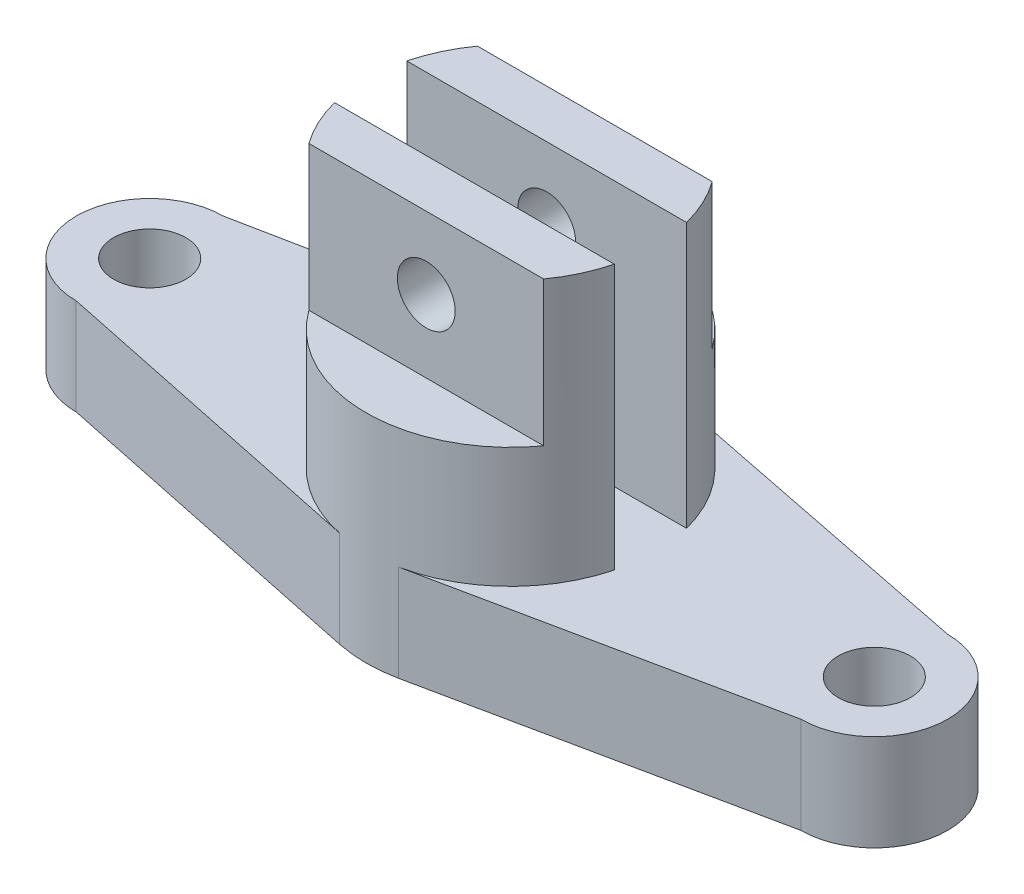
ISO-10303-21;
HEADER;
FILE_DESCRIPTION(('STEP AP214'),'2;1');
FILE_NAME('part.step','',(''),(''),'','','');
FILE_SCHEMA(('AUTOMOTIVE_DESIGN { 1 0 10303 214 1 1 1 1 }'));
ENDSEC;
DATA;
#1=APPLICATION_CONTEXT('core data for automotive mechanical design processes');
#2=APPLICATION_PROTOCOL_DEFINITION('international standard','automotive_design',2000,#1);
#3=PRODUCT_CONTEXT('',#1,'mechanical');
#4=PRODUCT('Part','Part','',(#3));
#5=PRODUCT_RELATED_PRODUCT_CATEGORY('part','',(#4));
#6=PRODUCT_DEFINITION_FORMATION('','',#4);
#7=PRODUCT_DEFINITION_CONTEXT('part definition',#1,'design');
#8=PRODUCT_DEFINITION('design','',#6,#7);
#9=PRODUCT_DEFINITION_SHAPE('','',#8);
#10=(LENGTH_UNIT() NAMED_UNIT(*) SI_UNIT(.MILLI.,.METRE.));
#11=(NAMED_UNIT(*) PLANE_ANGLE_UNIT() SI_UNIT($,.RADIAN.));
#12=(NAMED_UNIT(*) SI_UNIT($,.STERADIAN.) SOLID_ANGLE_UNIT());
#13=UNCERTAINTY_MEASURE_WITH_UNIT(LENGTH_MEASURE(1.E-05),#10,'distance_accuracy_value','');
#14=(GEOMETRIC_REPRESENTATION_CONTEXT(3) GLOBAL_UNCERTAINTY_ASSIGNED_CONTEXT((#13)) GLOBAL_UNIT_ASSIGNED_CONTEXT((#10,
#11,#12)) REPRESENTATION_CONTEXT('',''));
#15=CARTESIAN_POINT('',(0.,0.,0.));
#16=DIRECTION('',(0.,0.,1.));
#17=DIRECTION('',(1.,0.,0.));
#18=AXIS2_PLACEMENT_3D('',#15,#16,#17);
#19=CARTESIAN_POINT('',(0.,45.,0.));
#20=DIRECTION('',(0.,1.,0.));
#21=DIRECTION('',(0.,0.,1.));
#22=AXIS2_PLACEMENT_3D('',#19,#20,#21);
#23=PLANE('',#22);
#24=CARTESIAN_POINT('',(0.,45.,0.));
#25=DIRECTION('',(0.,1.,0.));
#26=DIRECTION('',(0.,0.,1.));
#27=AXIS2_PLACEMENT_3D('',#24,#25,#26);
#28=CIRCLE('',#27,30.);
#29=CARTESIAN_POINT('',(-24.3669858620224,45.,17.5));
#30=VERTEX_POINT('',#29);
#31=CARTESIAN_POINT('',(24.3669858620224,45.,17.5));
#32=VERTEX_POINT('',#31);
#33=EDGE_CURVE('E184',#30,#32,#28,.T.);
#34=ORIENTED_EDGE('',*,*,#33,.T.);
#35=DIRECTION('',(-1.,0.,0.));
#36=VECTOR('',#35,1.);
#37=CARTESIAN_POINT('',(0.,45.,17.5));
#38=LINE('',#37,#36);
#39=EDGE_CURVE('E190',#32,#30,#38,.T.);
#40=ORIENTED_EDGE('',*,*,#39,.T.);
#41=EDGE_LOOP('',(#34,#40));
#42=FACE_BOUND('',#41,.T.);
#43=ADVANCED_FACE('F53',(#42),#23,.T.);
#44=CARTESIAN_POINT('',(5.88348405414552,20.,-29.4174202707276));
#45=DIRECTION('',(-0.196116135138184,0.,0.98058067569092));
#46=DIRECTION('',(0.98058067569092,0.,0.196116135138184));
#47=AXIS2_PLACEMENT_3D('',#44,#45,#46);
#48=PLANE('',#47);
#49=DIRECTION('',(-0.98058067569092,0.,-0.196116135138184));
#50=VECTOR('',#49,1.);
#51=CARTESIAN_POINT('',(5.88348405414552,0.,-29.4174202707276));
#52=LINE('',#51,#50);
#53=CARTESIAN_POINT('',(75.2234894036946,0.,-15.5494192008178));
#54=VERTEX_POINT('',#53);
#55=CARTESIAN_POINT('',(5.88348405414552,0.,-29.4174202707276));
#56=VERTEX_POINT('',#55);
#57=EDGE_CURVE('E229',#54,#56,#52,.T.);
#58=ORIENTED_EDGE('',*,*,#57,.T.);
#59=DIRECTION('',(0.,-1.,0.));
#60=VECTOR('',#59,1.);
#61=CARTESIAN_POINT('',(5.88348405414552,20.,-29.4174202707276));
#62=LINE('',#61,#60);
#63=CARTESIAN_POINT('',(5.88348405414552,20.,-29.4174202707276));
#64=VERTEX_POINT('',#63);
#65=EDGE_CURVE('E301',#64,#56,#62,.T.);
#66=ORIENTED_EDGE('',*,*,#65,.F.);
#67=DIRECTION('',(-0.98058067569092,0.,-0.196116135138184));
#68=VECTOR('',#67,1.);
#69=CARTESIAN_POINT('',(5.88348405414552,20.,-29.4174202707276));
#70=LINE('',#69,#68);
#71=CARTESIAN_POINT('',(75.2234894036946,20.,-15.5494192008178));
#72=VERTEX_POINT('',#71);
#73=EDGE_CURVE('E239',#72,#64,#70,.T.);
#74=ORIENTED_EDGE('',*,*,#73,.F.);
#75=DIRECTION('',(0.,-1.,0.));
#76=VECTOR('',#75,1.);
#77=CARTESIAN_POINT('',(75.2234894036946,20.,-15.5494192008178));
#78=LINE('',#77,#76);
#79=EDGE_CURVE('E260',#72,#54,#78,.T.);
#80=ORIENTED_EDGE('',*,*,#79,.T.);
#81=EDGE_LOOP('',(#58,#66,#74,#80));
#82=FACE_BOUND('',#81,.T.);
#83=ADVANCED_FACE('F55',(#82),#48,.F.);
#84=CARTESIAN_POINT('',(0.,20.,0.));
#85=DIRECTION('',(0.,-1.,0.));
#86=DIRECTION('',(0.,0.,-1.));
#87=AXIS2_PLACEMENT_3D('',#84,#85,#86);
#88=CYLINDRICAL_SURFACE('',#87,30.);
#89=CARTESIAN_POINT('',(0.,0.,0.));
#90=DIRECTION('',(0.,1.,0.));
#91=DIRECTION('',(0.,0.,1.));
#92=AXIS2_PLACEMENT_3D('',#89,#90,#91);
#93=CIRCLE('',#92,30.);
#94=CARTESIAN_POINT('',(-5.88348405414552,0.,-29.4174202707276));
#95=VERTEX_POINT('',#94);
#96=EDGE_CURVE('E263',#56,#95,#93,.T.);
#97=ORIENTED_EDGE('',*,*,#96,.T.);
#98=DIRECTION('',(0.,-1.,0.));
#99=VECTOR('',#98,1.);
#100=CARTESIAN_POINT('',(-5.88348405414552,20.,-29.4174202707276));
#101=LINE('',#100,#99);
#102=CARTESIAN_POINT('',(-5.88348405414552,20.,-29.4174202707276));
#103=VERTEX_POINT('',#102);
#104=EDGE_CURVE('E300',#103,#95,#101,.T.);
#105=ORIENTED_EDGE('',*,*,#104,.F.);
#106=CARTESIAN_POINT('',(0.,20.,0.));
#107=DIRECTION('',(0.,1.,0.));
#108=DIRECTION('',(0.,0.,1.));
#109=AXIS2_PLACEMENT_3D('',#106,#107,#108);
#110=CIRCLE('',#109,30.);
#111=CARTESIAN_POINT('',(-29.0473750965556,20.,-7.5));
#112=VERTEX_POINT('',#111);
#113=EDGE_CURVE('E62',#103,#112,#110,.T.);
#114=ORIENTED_EDGE('',*,*,#113,.T.);
#115=DIRECTION('',(0.,-1.,0.));
#116=VECTOR('',#115,1.);
#117=CARTESIAN_POINT('',(-29.0473750965556,45.,-7.5));
#118=LINE('',#117,#116);
#119=CARTESIAN_POINT('',(-29.0473750965556,75.,-7.5));
#120=VERTEX_POINT('',#119);
#121=EDGE_CURVE('E200',#120,#112,#118,.T.);
#122=ORIENTED_EDGE('',*,*,#121,.F.);
#123=CARTESIAN_POINT('',(0.,75.,0.));
#124=DIRECTION('',(0.,1.,0.));
#125=DIRECTION('',(0.,0.,1.));
#126=AXIS2_PLACEMENT_3D('',#123,#124,#125);
#127=CIRCLE('',#126,30.);
#128=CARTESIAN_POINT('',(-24.3669858620224,75.,-17.5));
#129=VERTEX_POINT('',#128);
#130=EDGE_CURVE('E202',#129,#120,#127,.T.);
#131=ORIENTED_EDGE('',*,*,#130,.F.);
#132=DIRECTION('',(0.,-1.,0.));
#133=VECTOR('',#132,1.);
#134=CARTESIAN_POINT('',(-24.3669858620224,75.,-17.5));
#135=LINE('',#134,#133);
#136=CARTESIAN_POINT('',(-24.3669858620224,45.,-17.5));
#137=VERTEX_POINT('',#136);
#138=EDGE_CURVE('E212',#129,#137,#135,.T.);
#139=ORIENTED_EDGE('',*,*,#138,.T.);
#140=CARTESIAN_POINT('',(0.,45.,0.));
#141=DIRECTION('',(0.,1.,0.));
#142=DIRECTION('',(0.,0.,1.));
#143=AXIS2_PLACEMENT_3D('',#140,#141,#142);
#144=CIRCLE('',#143,30.);
#145=CARTESIAN_POINT('',(24.3669858620224,45.,-17.5));
#146=VERTEX_POINT('',#145);
#147=EDGE_CURVE('E233',#146,#137,#144,.T.);
#148=ORIENTED_EDGE('',*,*,#147,.F.);
#149=DIRECTION('',(0.,-1.,0.));
#150=VECTOR('',#149,1.);
#151=CARTESIAN_POINT('',(24.3669858620224,75.,-17.5));
#152=LINE('',#151,#150);
#153=CARTESIAN_POINT('',(24.3669858620224,75.,-17.5));
#154=VERTEX_POINT('',#153);
#155=EDGE_CURVE('E192',#154,#146,#152,.T.);
#156=ORIENTED_EDGE('',*,*,#155,.F.);
#157=CARTESIAN_POINT('',(0.,75.,0.));
#158=DIRECTION('',(0.,1.,0.));
#159=DIRECTION('',(0.,0.,1.));
#160=AXIS2_PLACEMENT_3D('',#157,#158,#159);
#161=CIRCLE('',#160,30.);
#162=CARTESIAN_POINT('',(29.0473750965556,75.,-7.5));
#163=VERTEX_POINT('',#162);
#164=EDGE_CURVE('E208',#163,#154,#161,.T.);
#165=ORIENTED_EDGE('',*,*,#164,.F.);
#166=DIRECTION('',(0.,-1.,0.));
#167=VECTOR('',#166,1.);
#168=CARTESIAN_POINT('',(29.0473750965556,45.,-7.5));
#169=LINE('',#168,#167);
#170=CARTESIAN_POINT('',(29.0473750965556,20.,-7.5));
#171=VERTEX_POINT('',#170);
#172=EDGE_CURVE('E231',#163,#171,#169,.T.);
#173=ORIENTED_EDGE('',*,*,#172,.T.);
#174=EDGE_CURVE('E222',#171,#64,#110,.T.);
#175=ORIENTED_EDGE('',*,*,#174,.T.);
#176=ORIENTED_EDGE('',*,*,#65,.T.);
#177=EDGE_LOOP('',(#97,#105,#114,#122,#131,#139,#148,#156,#165,#173,#175,#176));
#178=FACE_BOUND('',#177,.T.);
#179=ADVANCED_FACE('F307',(#178),#88,.T.);
#180=CARTESIAN_POINT('',(-5.88348405414552,20.,-29.4174202707276));
#181=DIRECTION('',(-0.196116135138184,0.,-0.98058067569092));
#182=DIRECTION('',(-0.98058067569092,0.,0.196116135138184));
#183=AXIS2_PLACEMENT_3D('',#180,#181,#182);
#184=PLANE('',#183);
#185=DIRECTION('',(0.98058067569092,0.,-0.196116135138184));
#186=VECTOR('',#185,1.);
#187=CARTESIAN_POINT('',(-5.88348405414552,0.,-29.4174202707276));
#188=LINE('',#187,#186);
#189=CARTESIAN_POINT('',(-75.2234894036946,0.,-15.5494192008178));
#190=VERTEX_POINT('',#189);
#191=EDGE_CURVE('E266',#190,#95,#188,.T.);
#192=ORIENTED_EDGE('',*,*,#191,.F.);
#193=DIRECTION('',(0.,-1.,0.));
#194=VECTOR('',#193,1.);
#195=CARTESIAN_POINT('',(-75.2234894036946,20.,-15.5494192008178));
#196=LINE('',#195,#194);
#197=CARTESIAN_POINT('',(-75.2234894036946,20.,-15.5494192008178));
#198=VERTEX_POINT('',#197);
#199=EDGE_CURVE('E298',#198,#190,#196,.T.);
#200=ORIENTED_EDGE('',*,*,#199,.F.);
#201=DIRECTION('',(0.98058067569092,0.,-0.196116135138184));
#202=VECTOR('',#201,1.);
#203=CARTESIAN_POINT('',(-5.88348405414552,20.,-29.4174202707276));
#204=LINE('',#203,#202);
#205=EDGE_CURVE('E242',#198,#103,#204,.T.);
#206=ORIENTED_EDGE('',*,*,#205,.T.);
#207=ORIENTED_EDGE('',*,*,#104,.T.);
#208=EDGE_LOOP('',(#192,#200,#206,#207));
#209=FACE_BOUND('',#208,.T.);
#210=ADVANCED_FACE('F340',(#209),#184,.T.);
#211=CARTESIAN_POINT('',(-75.2234894036946,20.,-0.29854411961578));
#212=DIRECTION('',(0.,-1.,0.));
#213=DIRECTION('',(0.,0.,-1.));
#214=AXIS2_PLACEMENT_3D('',#211,#212,#213);
#215=CYLINDRICAL_SURFACE('',#214,15.250875081202);
#216=CARTESIAN_POINT('',(-75.2234894036946,0.,-0.29854411961578));
#217=DIRECTION('',(0.,1.,0.));
#218=DIRECTION('',(0.,0.,1.));
#219=AXIS2_PLACEMENT_3D('',#216,#217,#218);
#220=CIRCLE('',#219,15.250875081202);
#221=CARTESIAN_POINT('',(-75.2234894036946,0.,14.9523309615862));
#222=VERTEX_POINT('',#221);
#223=EDGE_CURVE('E269',#190,#222,#220,.T.);
#224=ORIENTED_EDGE('',*,*,#223,.T.);
#225=DIRECTION('',(0.,-1.,0.));
#226=VECTOR('',#225,1.);
#227=CARTESIAN_POINT('',(-75.2234894036946,20.,14.9523309615862));
#228=LINE('',#227,#226);
#229=CARTESIAN_POINT('',(-75.2234894036946,20.,14.9523309615862));
#230=VERTEX_POINT('',#229);
#231=EDGE_CURVE('E295',#230,#222,#228,.T.);
#232=ORIENTED_EDGE('',*,*,#231,.F.);
#233=CARTESIAN_POINT('',(-75.2234894036946,20.,-0.29854411961578));
#234=DIRECTION('',(0.,1.,0.));
#235=DIRECTION('',(0.,0.,1.));
#236=AXIS2_PLACEMENT_3D('',#233,#234,#235);
#237=CIRCLE('',#236,15.250875081202);
#238=EDGE_CURVE('E246',#198,#230,#237,.T.);
#239=ORIENTED_EDGE('',*,*,#238,.F.);
#240=ORIENTED_EDGE('',*,*,#199,.T.);
#241=EDGE_LOOP('',(#224,#232,#239,#240));
#242=FACE_BOUND('',#241,.T.);
#243=ADVANCED_FACE('F346',(#242),#215,.T.);
#244=CARTESIAN_POINT('',(-6.12686966533405,20.,29.3676942932878));
#245=DIRECTION('',(0.204228988844468,0.,-0.978923143109594));
#246=DIRECTION('',(-0.978923143109594,0.,-0.204228988844468));
#247=AXIS2_PLACEMENT_3D('',#244,#245,#246);
#248=PLANE('',#247);
#249=DIRECTION('',(0.978923143109594,0.,0.204228988844468));
#250=VECTOR('',#249,1.);
#251=CARTESIAN_POINT('',(-6.12686966533405,0.,29.3676942932878));
#252=LINE('',#251,#250);
#253=CARTESIAN_POINT('',(-6.12686966533405,0.,29.3676942932878));
#254=VERTEX_POINT('',#253);
#255=EDGE_CURVE('E271',#222,#254,#252,.T.);
#256=ORIENTED_EDGE('',*,*,#255,.T.);
#257=DIRECTION('',(0.,-1.,0.));
#258=VECTOR('',#257,1.);
#259=CARTESIAN_POINT('',(-6.12686966533405,20.,29.3676942932878));
#260=LINE('',#259,#258);
#261=CARTESIAN_POINT('',(-6.12686966533405,20.,29.3676942932878));
#262=VERTEX_POINT('',#261);
#263=EDGE_CURVE('E292',#262,#254,#260,.T.);
#264=ORIENTED_EDGE('',*,*,#263,.F.);
#265=DIRECTION('',(0.978923143109594,0.,0.204228988844468));
#266=VECTOR('',#265,1.);
#267=CARTESIAN_POINT('',(-6.12686966533405,20.,29.3676942932878));
#268=LINE('',#267,#266);
#269=EDGE_CURVE('E248',#230,#262,#268,.T.);
#270=ORIENTED_EDGE('',*,*,#269,.F.);
#271=ORIENTED_EDGE('',*,*,#231,.T.);
#272=EDGE_LOOP('',(#256,#264,#270,#271));
#273=FACE_BOUND('',#272,.T.);
#274=ADVANCED_FACE('F348',(#273),#248,.F.);
#275=CARTESIAN_POINT('',(0.,20.,0.));
#276=DIRECTION('',(0.,-1.,0.));
#277=DIRECTION('',(0.,0.,-1.));
#278=AXIS2_PLACEMENT_3D('',#275,#276,#277);
#279=CYLINDRICAL_SURFACE('',#278,30.);
#280=CARTESIAN_POINT('',(0.,0.,0.));
#281=DIRECTION('',(0.,1.,0.));
#282=DIRECTION('',(0.,0.,1.));
#283=AXIS2_PLACEMENT_3D('',#280,#281,#282);
#284=CIRCLE('',#283,30.);
#285=CARTESIAN_POINT('',(6.12686966533405,0.,29.3676942932878));
#286=VERTEX_POINT('',#285);
#287=EDGE_CURVE('E273',#254,#286,#284,.T.);
#288=ORIENTED_EDGE('',*,*,#287,.T.);
#289=DIRECTION('',(0.,-1.,0.));
#290=VECTOR('',#289,1.);
#291=CARTESIAN_POINT('',(6.12686966533405,20.,29.3676942932878));
#292=LINE('',#291,#290);
#293=CARTESIAN_POINT('',(6.12686966533405,20.,29.3676942932878));
#294=VERTEX_POINT('',#293);
#295=EDGE_CURVE('E289',#294,#286,#292,.T.);
#296=ORIENTED_EDGE('',*,*,#295,.F.);
#297=CARTESIAN_POINT('',(0.,20.,0.));
#298=DIRECTION('',(0.,1.,0.));
#299=DIRECTION('',(0.,0.,1.));
#300=AXIS2_PLACEMENT_3D('',#297,#298,#299);
#301=CIRCLE('',#300,30.);
#302=CARTESIAN_POINT('',(29.0473750965556,20.,7.5));
#303=VERTEX_POINT('',#302);
#304=EDGE_CURVE('E12',#294,#303,#301,.T.);
#305=ORIENTED_EDGE('',*,*,#304,.T.);
#306=DIRECTION('',(0.,-1.,0.));
#307=VECTOR('',#306,1.);
#308=CARTESIAN_POINT('',(29.0473750965556,45.,7.5));
#309=LINE('',#308,#307);
#310=CARTESIAN_POINT('',(29.0473750965556,75.,7.5));
#311=VERTEX_POINT('',#310);
#312=EDGE_CURVE('E226',#311,#303,#309,.T.);
#313=ORIENTED_EDGE('',*,*,#312,.F.);
#314=CARTESIAN_POINT('',(0.,75.,0.));
#315=DIRECTION('',(0.,1.,0.));
#316=DIRECTION('',(0.,0.,1.));
#317=AXIS2_PLACEMENT_3D('',#314,#315,#316);
#318=CIRCLE('',#317,30.);
#319=CARTESIAN_POINT('',(24.3669858620224,75.,17.5));
#320=VERTEX_POINT('',#319);
#321=EDGE_CURVE('E186',#320,#311,#318,.T.);
#322=ORIENTED_EDGE('',*,*,#321,.F.);
#323=DIRECTION('',(0.,-1.,0.));
#324=VECTOR('',#323,1.);
#325=CARTESIAN_POINT('',(24.3669858620224,75.,17.5));
#326=LINE('',#325,#324);
#327=EDGE_CURVE('E185',#320,#32,#326,.T.);
#328=ORIENTED_EDGE('',*,*,#327,.T.);
#329=ORIENTED_EDGE('',*,*,#33,.F.);
#330=DIRECTION('',(0.,-1.,0.));
#331=VECTOR('',#330,1.);
#332=CARTESIAN_POINT('',(-24.3669858620224,75.,17.5));
#333=LINE('',#332,#331);
#334=CARTESIAN_POINT('',(-24.3669858620224,75.,17.5));
#335=VERTEX_POINT('',#334);
#336=EDGE_CURVE('E78',#335,#30,#333,.T.);
#337=ORIENTED_EDGE('',*,*,#336,.F.);
#338=CARTESIAN_POINT('',(0.,75.,0.));
#339=DIRECTION('',(0.,1.,0.));
#340=DIRECTION('',(0.,0.,1.));
#341=AXIS2_PLACEMENT_3D('',#338,#339,#340);
#342=CIRCLE('',#341,30.);
#343=CARTESIAN_POINT('',(-29.0473750965556,75.,7.49999999999997));
#344=VERTEX_POINT('',#343);
#345=EDGE_CURVE('E172',#344,#335,#342,.T.);
#346=ORIENTED_EDGE('',*,*,#345,.F.);
#347=DIRECTION('',(0.,-1.,0.));
#348=VECTOR('',#347,1.);
#349=CARTESIAN_POINT('',(-29.0473750965556,45.,7.49999999999999));
#350=LINE('',#349,#348);
#351=CARTESIAN_POINT('',(-29.0473750965556,20.,7.49999999999999));
#352=VERTEX_POINT('',#351);
#353=EDGE_CURVE('E218',#344,#352,#350,.T.);
#354=ORIENTED_EDGE('',*,*,#353,.T.);
#355=EDGE_CURVE('E64',#352,#262,#301,.T.);
#356=ORIENTED_EDGE('',*,*,#355,.T.);
#357=ORIENTED_EDGE('',*,*,#263,.T.);
#358=EDGE_LOOP('',(#288,#296,#305,#313,#322,#328,#329,#337,#346,#354,#356,#357));
#359=FACE_BOUND('',#358,.T.);
#360=ADVANCED_FACE('F182',(#359),#279,.T.);
#361=CARTESIAN_POINT('',(6.12686966533405,20.,29.3676942932878));
#362=DIRECTION('',(-0.204228988844468,0.,-0.978923143109594));
#363=DIRECTION('',(-0.978923143109594,0.,0.204228988844468));
#364=AXIS2_PLACEMENT_3D('',#361,#362,#363);
#365=PLANE('',#364);
#366=DIRECTION('',(0.978923143109594,0.,-0.204228988844468));
#367=VECTOR('',#366,1.);
#368=CARTESIAN_POINT('',(6.12686966533405,0.,29.3676942932878));
#369=LINE('',#368,#367);
#370=CARTESIAN_POINT('',(75.2234894036946,0.,14.9523309615862));
#371=VERTEX_POINT('',#370);
#372=EDGE_CURVE('E275',#286,#371,#369,.T.);
#373=ORIENTED_EDGE('',*,*,#372,.T.);
#374=DIRECTION('',(0.,-1.,0.));
#375=VECTOR('',#374,1.);
#376=CARTESIAN_POINT('',(75.2234894036946,20.,14.9523309615862));
#377=LINE('',#376,#375);
#378=CARTESIAN_POINT('',(75.2234894036946,20.,14.9523309615862));
#379=VERTEX_POINT('',#378);
#380=EDGE_CURVE('E286',#379,#371,#377,.T.);
#381=ORIENTED_EDGE('',*,*,#380,.F.);
#382=DIRECTION('',(0.978923143109594,0.,-0.204228988844468));
#383=VECTOR('',#382,1.);
#384=CARTESIAN_POINT('',(6.12686966533405,20.,29.3676942932878));
#385=LINE('',#384,#383);
#386=EDGE_CURVE('E250',#294,#379,#385,.T.);
#387=ORIENTED_EDGE('',*,*,#386,.F.);
#388=ORIENTED_EDGE('',*,*,#295,.T.);
#389=EDGE_LOOP('',(#373,#381,#387,#388));
#390=FACE_BOUND('',#389,.T.);
#391=ADVANCED_FACE('F356',(#390),#365,.F.);
#392=CARTESIAN_POINT('',(-75.2234894036946,20.,-0.29854411961578));
#393=DIRECTION('',(0.,-1.,0.));
#394=DIRECTION('',(0.,0.,-1.));
#395=AXIS2_PLACEMENT_3D('',#392,#393,#394);
#396=CYLINDRICAL_SURFACE('',#395,7.5);
#397=CARTESIAN_POINT('',(-75.2234894036946,20.,-0.29854411961578));
#398=DIRECTION('',(0.,1.,0.));
#399=DIRECTION('',(0.,0.,1.));
#400=AXIS2_PLACEMENT_3D('',#397,#398,#399);
#401=CIRCLE('',#400,7.5);
#402=CARTESIAN_POINT('',(-75.2234894036946,20.,7.20145588038422));
#403=VERTEX_POINT('',#402);
#404=EDGE_CURVE('E254',#403,#403,#401,.T.);
#405=ORIENTED_EDGE('',*,*,#404,.T.);
#406=EDGE_LOOP('',(#405));
#407=FACE_BOUND('',#406,.T.);
#408=CARTESIAN_POINT('',(-75.2234894036946,0.,-0.29854411961578));
#409=DIRECTION('',(0.,1.,0.));
#410=DIRECTION('',(0.,0.,1.));
#411=AXIS2_PLACEMENT_3D('',#408,#409,#410);
#412=CIRCLE('',#411,7.5);
#413=CARTESIAN_POINT('',(-75.2234894036946,0.,7.20145588038422));
#414=VERTEX_POINT('',#413);
#415=EDGE_CURVE('E279',#414,#414,#412,.T.);
#416=ORIENTED_EDGE('',*,*,#415,.F.);
#417=EDGE_LOOP('',(#416));
#418=FACE_BOUND('',#417,.T.);
#419=ADVANCED_FACE('F361',(#407,#418),#396,.F.);
#420=CARTESIAN_POINT('',(75.2234894036946,20.,-0.298544119615793));
#421=DIRECTION('',(0.,-1.,0.));
#422=DIRECTION('',(0.,0.,-1.));
#423=AXIS2_PLACEMENT_3D('',#420,#421,#422);
#424=CYLINDRICAL_SURFACE('',#423,15.250875081202);
#425=CARTESIAN_POINT('',(75.2234894036946,0.,-0.298544119615793));
#426=DIRECTION('',(0.,1.,0.));
#427=DIRECTION('',(0.,0.,1.));
#428=AXIS2_PLACEMENT_3D('',#425,#426,#427);
#429=CIRCLE('',#428,15.250875081202);
#430=EDGE_CURVE('E277',#371,#54,#429,.T.);
#431=ORIENTED_EDGE('',*,*,#430,.T.);
#432=ORIENTED_EDGE('',*,*,#79,.F.);
#433=CARTESIAN_POINT('',(75.2234894036946,20.,-0.298544119615793));
#434=DIRECTION('',(0.,1.,0.));
#435=DIRECTION('',(0.,0.,1.));
#436=AXIS2_PLACEMENT_3D('',#433,#434,#435);
#437=CIRCLE('',#436,15.250875081202);
#438=EDGE_CURVE('E252',#379,#72,#437,.T.);
#439=ORIENTED_EDGE('',*,*,#438,.F.);
#440=ORIENTED_EDGE('',*,*,#380,.T.);
#441=EDGE_LOOP('',(#431,#432,#439,#440));
#442=FACE_BOUND('',#441,.T.);
#443=ADVANCED_FACE('F358',(#442),#424,.T.);
#444=CARTESIAN_POINT('',(75.2234894036946,20.,-0.298544119615793));
#445=DIRECTION('',(0.,-1.,0.));
#446=DIRECTION('',(0.,0.,-1.));
#447=AXIS2_PLACEMENT_3D('',#444,#445,#446);
#448=CYLINDRICAL_SURFACE('',#447,7.5);
#449=CARTESIAN_POINT('',(75.2234894036946,20.,-0.298544119615793));
#450=DIRECTION('',(0.,1.,0.));
#451=DIRECTION('',(0.,0.,1.));
#452=AXIS2_PLACEMENT_3D('',#449,#450,#451);
#453=CIRCLE('',#452,7.5);
#454=CARTESIAN_POINT('',(75.2234894036946,20.,7.20145588038421));
#455=VERTEX_POINT('',#454);
#456=EDGE_CURVE('E257',#455,#455,#453,.T.);
#457=ORIENTED_EDGE('',*,*,#456,.T.);
#458=EDGE_LOOP('',(#457));
#459=FACE_BOUND('',#458,.T.);
#460=CARTESIAN_POINT('',(75.2234894036946,0.,-0.298544119615793));
#461=DIRECTION('',(0.,1.,0.));
#462=DIRECTION('',(0.,0.,1.));
#463=AXIS2_PLACEMENT_3D('',#460,#461,#462);
#464=CIRCLE('',#463,7.5);
#465=CARTESIAN_POINT('',(75.2234894036946,0.,7.20145588038421));
#466=VERTEX_POINT('',#465);
#467=EDGE_CURVE('E243',#466,#466,#464,.T.);
#468=ORIENTED_EDGE('',*,*,#467,.F.);
#469=EDGE_LOOP('',(#468));
#470=FACE_BOUND('',#469,.T.);
#471=ADVANCED_FACE('F360',(#459,#470),#448,.F.);
#472=CARTESIAN_POINT('',(0.,20.,0.));
#473=DIRECTION('',(0.,1.,0.));
#474=DIRECTION('',(0.,0.,1.));
#475=AXIS2_PLACEMENT_3D('',#472,#473,#474);
#476=PLANE('',#475);
#477=ORIENTED_EDGE('',*,*,#355,.F.);
#478=DIRECTION('',(-1.,0.,0.));
#479=VECTOR('',#478,1.);
#480=CARTESIAN_POINT('',(0.,20.,7.5));
#481=LINE('',#480,#479);
#482=EDGE_CURVE('E219',#303,#352,#481,.T.);
#483=ORIENTED_EDGE('',*,*,#482,.F.);
#484=ORIENTED_EDGE('',*,*,#304,.F.);
#485=ORIENTED_EDGE('',*,*,#386,.T.);
#486=ORIENTED_EDGE('',*,*,#438,.T.);
#487=ORIENTED_EDGE('',*,*,#73,.T.);
#488=ORIENTED_EDGE('',*,*,#174,.F.);
#489=DIRECTION('',(-1.,0.,0.));
#490=VECTOR('',#489,1.);
#491=CARTESIAN_POINT('',(0.,20.,-7.5));
#492=LINE('',#491,#490);
#493=EDGE_CURVE('E234',#171,#112,#492,.T.);
#494=ORIENTED_EDGE('',*,*,#493,.T.);
#495=ORIENTED_EDGE('',*,*,#113,.F.);
#496=ORIENTED_EDGE('',*,*,#205,.F.);
#497=ORIENTED_EDGE('',*,*,#238,.T.);
#498=ORIENTED_EDGE('',*,*,#269,.T.);
#499=EDGE_LOOP('',(#477,#483,#484,#485,#486,#487,#488,#494,#495,#496,#497,#498));
#500=FACE_BOUND('',#499,.T.);
#501=ORIENTED_EDGE('',*,*,#404,.F.);
#502=EDGE_LOOP('',(#501));
#503=FACE_BOUND('',#502,.T.);
#504=ORIENTED_EDGE('',*,*,#456,.F.);
#505=EDGE_LOOP('',(#504));
#506=FACE_BOUND('',#505,.T.);
#507=ADVANCED_FACE('F313',(#500,#503,#506),#476,.T.);
#508=CARTESIAN_POINT('',(0.,0.,0.));
#509=DIRECTION('',(0.,1.,0.));
#510=DIRECTION('',(0.,0.,1.));
#511=AXIS2_PLACEMENT_3D('',#508,#509,#510);
#512=PLANE('',#511);
#513=ORIENTED_EDGE('',*,*,#57,.F.);
#514=ORIENTED_EDGE('',*,*,#430,.F.);
#515=ORIENTED_EDGE('',*,*,#372,.F.);
#516=ORIENTED_EDGE('',*,*,#287,.F.);
#517=ORIENTED_EDGE('',*,*,#255,.F.);
#518=ORIENTED_EDGE('',*,*,#223,.F.);
#519=ORIENTED_EDGE('',*,*,#191,.T.);
#520=ORIENTED_EDGE('',*,*,#96,.F.);
#521=EDGE_LOOP('',(#513,#514,#515,#516,#517,#518,#519,#520));
#522=FACE_BOUND('',#521,.T.);
#523=ORIENTED_EDGE('',*,*,#415,.T.);
#524=EDGE_LOOP('',(#523));
#525=FACE_BOUND('',#524,.T.);
#526=ORIENTED_EDGE('',*,*,#467,.T.);
#527=EDGE_LOOP('',(#526));
#528=FACE_BOUND('',#527,.T.);
#529=ADVANCED_FACE('F333',(#522,#525,#528),#512,.F.);
#530=CARTESIAN_POINT('',(0.,45.,-7.5));
#531=DIRECTION('',(0.,0.,1.));
#532=DIRECTION('',(1.,0.,0.));
#533=AXIS2_PLACEMENT_3D('',#530,#531,#532);
#534=PLANE('',#533);
#535=CARTESIAN_POINT('',(0.,60.,-7.5));
#536=DIRECTION('',(0.,0.,1.));
#537=DIRECTION('',(1.,0.,0.));
#538=AXIS2_PLACEMENT_3D('',#535,#536,#537);
#539=CIRCLE('',#538,6.);
#540=CARTESIAN_POINT('',(5.99999999999997,60.,-7.5));
#541=VERTEX_POINT('',#540);
#542=EDGE_CURVE('E195',#541,#541,#539,.T.);
#543=ORIENTED_EDGE('',*,*,#542,.F.);
#544=EDGE_LOOP('',(#543));
#545=FACE_BOUND('',#544,.T.);
#546=ORIENTED_EDGE('',*,*,#493,.F.);
#547=ORIENTED_EDGE('',*,*,#172,.F.);
#548=DIRECTION('',(-1.,0.,0.));
#549=VECTOR('',#548,1.);
#550=CARTESIAN_POINT('',(0.,75.,-7.5));
#551=LINE('',#550,#549);
#552=EDGE_CURVE('E205',#163,#120,#551,.T.);
#553=ORIENTED_EDGE('',*,*,#552,.T.);
#554=ORIENTED_EDGE('',*,*,#121,.T.);
#555=EDGE_LOOP('',(#546,#547,#553,#554));
#556=FACE_BOUND('',#555,.T.);
#557=ADVANCED_FACE('F316',(#545,#556),#534,.T.);
#558=CARTESIAN_POINT('',(0.,45.,0.));
#559=DIRECTION('',(0.,1.,0.));
#560=DIRECTION('',(0.,0.,1.));
#561=AXIS2_PLACEMENT_3D('',#558,#559,#560);
#562=PLANE('',#561);
#563=DIRECTION('',(-1.,0.,0.));
#564=VECTOR('',#563,1.);
#565=CARTESIAN_POINT('',(0.,45.,-17.5));
#566=LINE('',#565,#564);
#567=EDGE_CURVE('E70',#146,#137,#566,.T.);
#568=ORIENTED_EDGE('',*,*,#567,.F.);
#569=ORIENTED_EDGE('',*,*,#147,.T.);
#570=EDGE_LOOP('',(#568,#569));
#571=FACE_BOUND('',#570,.T.);
#572=ADVANCED_FACE('F385',(#571),#562,.T.);
#573=CARTESIAN_POINT('',(0.,45.,7.5));
#574=DIRECTION('',(0.,0.,1.));
#575=DIRECTION('',(1.,0.,0.));
#576=AXIS2_PLACEMENT_3D('',#573,#574,#575);
#577=PLANE('',#576);
#578=CARTESIAN_POINT('',(0.,60.,7.49999999999999));
#579=DIRECTION('',(0.,0.,1.));
#580=DIRECTION('',(1.,0.,0.));
#581=AXIS2_PLACEMENT_3D('',#578,#579,#580);
#582=CIRCLE('',#581,6.);
#583=CARTESIAN_POINT('',(5.99999999999997,60.,7.49999999999999));
#584=VERTEX_POINT('',#583);
#585=EDGE_CURVE('E601',#584,#584,#582,.T.);
#586=ORIENTED_EDGE('',*,*,#585,.T.);
#587=EDGE_LOOP('',(#586));
#588=FACE_BOUND('',#587,.T.);
#589=ORIENTED_EDGE('',*,*,#482,.T.);
#590=ORIENTED_EDGE('',*,*,#353,.F.);
#591=DIRECTION('',(-1.,0.,0.));
#592=VECTOR('',#591,1.);
#593=CARTESIAN_POINT('',(0.,75.,7.5));
#594=LINE('',#593,#592);
#595=EDGE_CURVE('E177',#311,#344,#594,.T.);
#596=ORIENTED_EDGE('',*,*,#595,.F.);
#597=ORIENTED_EDGE('',*,*,#312,.T.);
#598=EDGE_LOOP('',(#589,#590,#596,#597));
#599=FACE_BOUND('',#598,.T.);
#600=ADVANCED_FACE('F351',(#588,#599),#577,.F.);
#601=CARTESIAN_POINT('',(0.,75.,17.5));
#602=DIRECTION('',(0.,0.,1.));
#603=DIRECTION('',(1.,0.,0.));
#604=AXIS2_PLACEMENT_3D('',#601,#602,#603);
#605=PLANE('',#604);
#606=CARTESIAN_POINT('',(0.,60.,17.5));
#607=DIRECTION('',(0.,0.,1.));
#608=DIRECTION('',(1.,0.,0.));
#609=AXIS2_PLACEMENT_3D('',#606,#607,#608);
#610=CIRCLE('',#609,6.);
#611=CARTESIAN_POINT('',(5.99999999999997,60.,17.5));
#612=VERTEX_POINT('',#611);
#613=EDGE_CURVE('E598',#612,#612,#610,.T.);
#614=ORIENTED_EDGE('',*,*,#613,.F.);
#615=EDGE_LOOP('',(#614));
#616=FACE_BOUND('',#615,.T.);
#617=ORIENTED_EDGE('',*,*,#39,.F.);
#618=ORIENTED_EDGE('',*,*,#327,.F.);
#619=DIRECTION('',(-1.,0.,0.));
#620=VECTOR('',#619,1.);
#621=CARTESIAN_POINT('',(0.,75.,17.5));
#622=LINE('',#621,#620);
#623=EDGE_CURVE('E175',#320,#335,#622,.T.);
#624=ORIENTED_EDGE('',*,*,#623,.T.);
#625=ORIENTED_EDGE('',*,*,#336,.T.);
#626=EDGE_LOOP('',(#617,#618,#624,#625));
#627=FACE_BOUND('',#626,.T.);
#628=ADVANCED_FACE('F188',(#616,#627),#605,.T.);
#629=CARTESIAN_POINT('',(0.,75.,0.));
#630=DIRECTION('',(0.,1.,0.));
#631=DIRECTION('',(0.,0.,1.));
#632=AXIS2_PLACEMENT_3D('',#629,#630,#631);
#633=PLANE('',#632);
#634=ORIENTED_EDGE('',*,*,#623,.F.);
#635=ORIENTED_EDGE('',*,*,#321,.T.);
#636=ORIENTED_EDGE('',*,*,#595,.T.);
#637=ORIENTED_EDGE('',*,*,#345,.T.);
#638=EDGE_LOOP('',(#634,#635,#636,#637));
#639=FACE_BOUND('',#638,.T.);
#640=ADVANCED_FACE('F173',(#639),#633,.T.);
#641=CARTESIAN_POINT('',(0.,75.,-17.5));
#642=DIRECTION('',(0.,0.,1.));
#643=DIRECTION('',(1.,0.,0.));
#644=AXIS2_PLACEMENT_3D('',#641,#642,#643);
#645=PLANE('',#644);
#646=CARTESIAN_POINT('',(0.,60.,-17.5));
#647=DIRECTION('',(0.,0.,1.));
#648=DIRECTION('',(1.,0.,0.));
#649=AXIS2_PLACEMENT_3D('',#646,#647,#648);
#650=CIRCLE('',#649,6.);
#651=CARTESIAN_POINT('',(5.99999999999997,60.,-17.5));
#652=VERTEX_POINT('',#651);
#653=EDGE_CURVE('E57',#652,#652,#650,.T.);
#654=ORIENTED_EDGE('',*,*,#653,.T.);
#655=EDGE_LOOP('',(#654));
#656=FACE_BOUND('',#655,.T.);
#657=ORIENTED_EDGE('',*,*,#567,.T.);
#658=ORIENTED_EDGE('',*,*,#138,.F.);
#659=DIRECTION('',(-1.,0.,0.));
#660=VECTOR('',#659,1.);
#661=CARTESIAN_POINT('',(0.,75.,-17.5));
#662=LINE('',#661,#660);
#663=EDGE_CURVE('E210',#154,#129,#662,.T.);
#664=ORIENTED_EDGE('',*,*,#663,.F.);
#665=ORIENTED_EDGE('',*,*,#155,.T.);
#666=EDGE_LOOP('',(#657,#658,#664,#665));
#667=FACE_BOUND('',#666,.T.);
#668=ADVANCED_FACE('F325',(#656,#667),#645,.F.);
#669=CARTESIAN_POINT('',(0.,75.,0.));
#670=DIRECTION('',(0.,1.,0.));
#671=DIRECTION('',(0.,0.,1.));
#672=AXIS2_PLACEMENT_3D('',#669,#670,#671);
#673=PLANE('',#672);
#674=ORIENTED_EDGE('',*,*,#130,.T.);
#675=ORIENTED_EDGE('',*,*,#552,.F.);
#676=ORIENTED_EDGE('',*,*,#164,.T.);
#677=ORIENTED_EDGE('',*,*,#663,.T.);
#678=EDGE_LOOP('',(#674,#675,#676,#677));
#679=FACE_BOUND('',#678,.T.);
#680=ADVANCED_FACE('F320',(#679),#673,.T.);
#681=CARTESIAN_POINT('',(0.,60.,-30.));
#682=DIRECTION('',(0.,0.,1.));
#683=DIRECTION('',(1.,0.,0.));
#684=AXIS2_PLACEMENT_3D('',#681,#682,#683);
#685=CYLINDRICAL_SURFACE('',#684,6.);
#686=ORIENTED_EDGE('',*,*,#542,.T.);
#687=EDGE_LOOP('',(#686));
#688=FACE_BOUND('',#687,.T.);
#689=ORIENTED_EDGE('',*,*,#653,.F.);
#690=EDGE_LOOP('',(#689));
#691=FACE_BOUND('',#690,.T.);
#692=ADVANCED_FACE('F502',(#688,#691),#685,.F.);
#693=ORIENTED_EDGE('',*,*,#613,.T.);
#694=EDGE_LOOP('',(#693));
#695=FACE_BOUND('',#694,.T.);
#696=ORIENTED_EDGE('',*,*,#585,.F.);
#697=EDGE_LOOP('',(#696));
#698=FACE_BOUND('',#697,.T.);
#699=ADVANCED_FACE('F509',(#695,#698),#685,.F.);
#700=CLOSED_SHELL('',(#43,#83,#179,#210,#243,#274,#360,#391,#419,#443,#471,#507,#529,#557,#572,
#600,#628,#640,#668,#680,#692,#699));
#701=MANIFOLD_SOLID_BREP('B2',#700);
#702=ADVANCED_BREP_SHAPE_REPRESENTATION('',(#18,#701),#14);
#703=SHAPE_DEFINITION_REPRESENTATION(#9,#702);
ENDSEC;
END-ISO-10303-21;
